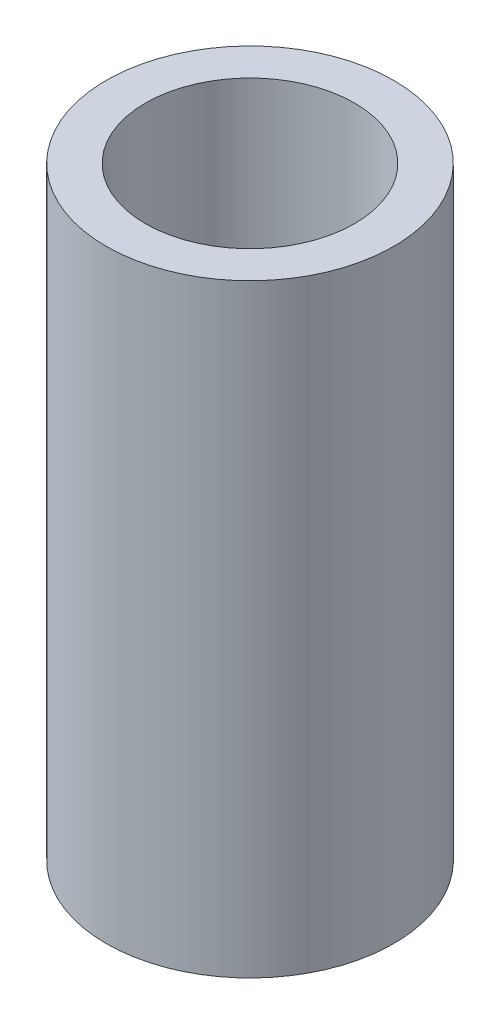
ISO-10303-21;
HEADER;
FILE_DESCRIPTION(('STEP AP214'),'2;1');
FILE_NAME('part.step','',(''),(''),'','','');
FILE_SCHEMA(('AUTOMOTIVE_DESIGN { 1 0 10303 214 1 1 1 1 }'));
ENDSEC;
DATA;
#1=APPLICATION_CONTEXT('core data for automotive mechanical design processes');
#2=APPLICATION_PROTOCOL_DEFINITION('international standard','automotive_design',2000,#1);
#3=PRODUCT_CONTEXT('',#1,'mechanical');
#4=PRODUCT('Part','Part','',(#3));
#5=PRODUCT_RELATED_PRODUCT_CATEGORY('part','',(#4));
#6=PRODUCT_DEFINITION_FORMATION('','',#4);
#7=PRODUCT_DEFINITION_CONTEXT('part definition',#1,'design');
#8=PRODUCT_DEFINITION('design','',#6,#7);
#9=PRODUCT_DEFINITION_SHAPE('','',#8);
#10=(LENGTH_UNIT() NAMED_UNIT(*) SI_UNIT(.MILLI.,.METRE.));
#11=(NAMED_UNIT(*) PLANE_ANGLE_UNIT() SI_UNIT($,.RADIAN.));
#12=(NAMED_UNIT(*) SI_UNIT($,.STERADIAN.) SOLID_ANGLE_UNIT());
#13=UNCERTAINTY_MEASURE_WITH_UNIT(LENGTH_MEASURE(1.E-05),#10,'distance_accuracy_value','');
#14=(GEOMETRIC_REPRESENTATION_CONTEXT(3) GLOBAL_UNCERTAINTY_ASSIGNED_CONTEXT((#13)) GLOBAL_UNIT_ASSIGNED_CONTEXT((#10,
#11,#12)) REPRESENTATION_CONTEXT('',''));
#15=CARTESIAN_POINT('',(0.,0.,0.));
#16=DIRECTION('',(0.,0.,1.));
#17=DIRECTION('',(1.,0.,0.));
#18=AXIS2_PLACEMENT_3D('',#15,#16,#17);
#19=CARTESIAN_POINT('',(0.,23.1,0.));
#20=DIRECTION('',(0.,1.,0.));
#21=DIRECTION('',(0.,0.,1.));
#22=AXIS2_PLACEMENT_3D('',#19,#20,#21);
#23=PLANE('',#22);
#24=CARTESIAN_POINT('',(0.,23.1,0.));
#25=DIRECTION('',(0.,1.,0.));
#26=DIRECTION('',(0.,0.,1.));
#27=AXIS2_PLACEMENT_3D('',#24,#25,#26);
#28=CIRCLE('',#27,5.5);
#29=CARTESIAN_POINT('',(0.,23.1,5.5));
#30=VERTEX_POINT('',#29);
#31=EDGE_CURVE('E10',#30,#30,#28,.T.);
#32=ORIENTED_EDGE('',*,*,#31,.T.);
#33=EDGE_LOOP('',(#32));
#34=FACE_BOUND('',#33,.T.);
#35=CARTESIAN_POINT('',(0.,23.1,0.));
#36=DIRECTION('',(0.,1.,0.));
#37=DIRECTION('',(0.,0.,1.));
#38=AXIS2_PLACEMENT_3D('',#35,#36,#37);
#39=CIRCLE('',#38,4.);
#40=CARTESIAN_POINT('',(0.,23.1,4.));
#41=VERTEX_POINT('',#40);
#42=EDGE_CURVE('E42',#41,#41,#39,.T.);
#43=ORIENTED_EDGE('',*,*,#42,.F.);
#44=EDGE_LOOP('',(#43));
#45=FACE_BOUND('',#44,.T.);
#46=ADVANCED_FACE('F31',(#34,#45),#23,.T.);
#47=CARTESIAN_POINT('',(0.,0.,0.));
#48=DIRECTION('',(0.,1.,0.));
#49=DIRECTION('',(0.,0.,1.));
#50=AXIS2_PLACEMENT_3D('',#47,#48,#49);
#51=PLANE('',#50);
#52=CARTESIAN_POINT('',(0.,0.,0.));
#53=DIRECTION('',(0.,1.,0.));
#54=DIRECTION('',(0.,0.,1.));
#55=AXIS2_PLACEMENT_3D('',#52,#53,#54);
#56=CIRCLE('',#55,5.5);
#57=CARTESIAN_POINT('',(0.,0.,5.5));
#58=VERTEX_POINT('',#57);
#59=EDGE_CURVE('E35',#58,#58,#56,.T.);
#60=ORIENTED_EDGE('',*,*,#59,.F.);
#61=EDGE_LOOP('',(#60));
#62=FACE_BOUND('',#61,.T.);
#63=CARTESIAN_POINT('',(0.,0.,0.));
#64=DIRECTION('',(0.,1.,0.));
#65=DIRECTION('',(0.,0.,1.));
#66=AXIS2_PLACEMENT_3D('',#63,#64,#65);
#67=CIRCLE('',#66,4.);
#68=CARTESIAN_POINT('',(0.,0.,4.));
#69=VERTEX_POINT('',#68);
#70=EDGE_CURVE('E44',#69,#69,#67,.T.);
#71=ORIENTED_EDGE('',*,*,#70,.T.);
#72=EDGE_LOOP('',(#71));
#73=FACE_BOUND('',#72,.T.);
#74=ADVANCED_FACE('F54',(#62,#73),#51,.F.);
#75=CARTESIAN_POINT('',(0.,23.1,0.));
#76=DIRECTION('',(0.,-1.,0.));
#77=DIRECTION('',(0.,0.,-1.));
#78=AXIS2_PLACEMENT_3D('',#75,#76,#77);
#79=CYLINDRICAL_SURFACE('',#78,5.5);
#80=ORIENTED_EDGE('',*,*,#31,.F.);
#81=EDGE_LOOP('',(#80));
#82=FACE_BOUND('',#81,.T.);
#83=ORIENTED_EDGE('',*,*,#59,.T.);
#84=EDGE_LOOP('',(#83));
#85=FACE_BOUND('',#84,.T.);
#86=ADVANCED_FACE('F33',(#82,#85),#79,.T.);
#87=CARTESIAN_POINT('',(0.,23.1,0.));
#88=DIRECTION('',(0.,-1.,0.));
#89=DIRECTION('',(0.,0.,-1.));
#90=AXIS2_PLACEMENT_3D('',#87,#88,#89);
#91=CYLINDRICAL_SURFACE('',#90,4.);
#92=ORIENTED_EDGE('',*,*,#42,.T.);
#93=EDGE_LOOP('',(#92));
#94=FACE_BOUND('',#93,.T.);
#95=ORIENTED_EDGE('',*,*,#70,.F.);
#96=EDGE_LOOP('',(#95));
#97=FACE_BOUND('',#96,.T.);
#98=ADVANCED_FACE('F50',(#94,#97),#91,.F.);
#99=CLOSED_SHELL('',(#46,#74,#86,#98));
#100=MANIFOLD_SOLID_BREP('B2',#99);
#101=ADVANCED_BREP_SHAPE_REPRESENTATION('',(#18,#100),#14);
#102=SHAPE_DEFINITION_REPRESENTATION(#9,#101);
ENDSEC;
END-ISO-10303-21;
